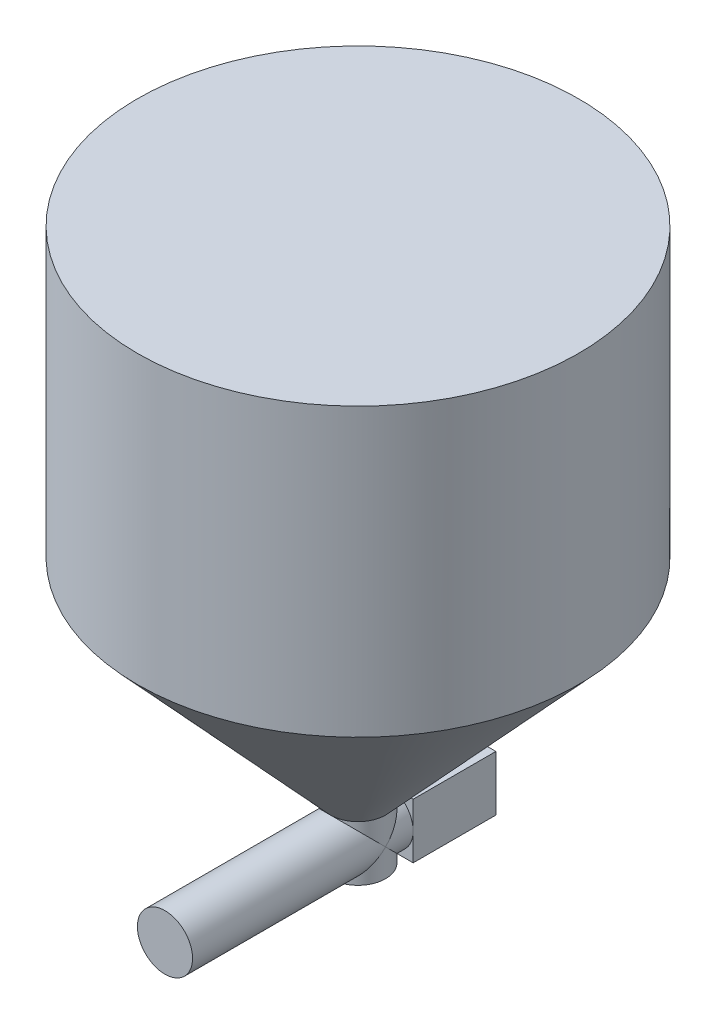
ISO-10303-21;
HEADER;
FILE_DESCRIPTION(('STEP AP214'),'2;1');
FILE_NAME('part.step','',(''),(''),'','','');
FILE_SCHEMA(('AUTOMOTIVE_DESIGN { 1 0 10303 214 1 1 1 1 }'));
ENDSEC;
DATA;
#1=APPLICATION_CONTEXT('core data for automotive mechanical design processes');
#2=APPLICATION_PROTOCOL_DEFINITION('international standard','automotive_design',2000,#1);
#3=PRODUCT_CONTEXT('',#1,'mechanical');
#4=PRODUCT('Part','Part','',(#3));
#5=PRODUCT_RELATED_PRODUCT_CATEGORY('part','',(#4));
#6=PRODUCT_DEFINITION_FORMATION('','',#4);
#7=PRODUCT_DEFINITION_CONTEXT('part definition',#1,'design');
#8=PRODUCT_DEFINITION('design','',#6,#7);
#9=PRODUCT_DEFINITION_SHAPE('','',#8);
#10=(LENGTH_UNIT() NAMED_UNIT(*) SI_UNIT(.MILLI.,.METRE.));
#11=(NAMED_UNIT(*) PLANE_ANGLE_UNIT() SI_UNIT($,.RADIAN.));
#12=(NAMED_UNIT(*) SI_UNIT($,.STERADIAN.) SOLID_ANGLE_UNIT());
#13=UNCERTAINTY_MEASURE_WITH_UNIT(LENGTH_MEASURE(1.E-05),#10,'distance_accuracy_value','');
#14=(GEOMETRIC_REPRESENTATION_CONTEXT(3) GLOBAL_UNCERTAINTY_ASSIGNED_CONTEXT((#13)) GLOBAL_UNIT_ASSIGNED_CONTEXT((#10,
#11,#12)) REPRESENTATION_CONTEXT('',''));
#15=CARTESIAN_POINT('',(0.,0.,0.));
#16=DIRECTION('',(0.,0.,1.));
#17=DIRECTION('',(1.,0.,0.));
#18=AXIS2_PLACEMENT_3D('',#15,#16,#17);
#19=CARTESIAN_POINT('',(0.,-1000.,0.));
#20=DIRECTION('',(0.,1.,0.));
#21=DIRECTION('',(0.,0.,1.));
#22=AXIS2_PLACEMENT_3D('',#19,#20,#21);
#23=CYLINDRICAL_SURFACE('',#22,50.);
#24=CARTESIAN_POINT('',(0.,-950.,0.));
#25=DIRECTION('',(0.,0.707106781186547,-0.707106781186547));
#26=DIRECTION('',(0.,0.707106781186547,0.707106781186547));
#27=AXIS2_PLACEMENT_3D('',#24,#25,#26);
#28=ELLIPSE('',#27,70.7106781186548,50.);
#29=CARTESIAN_POINT('',(-2.66453525910038E-13,-900.,50.));
#30=VERTEX_POINT('',#29);
#31=CARTESIAN_POINT('',(50.,-950.,0.));
#32=VERTEX_POINT('',#31);
#33=EDGE_CURVE('E206',#30,#32,#28,.T.);
#34=ORIENTED_EDGE('',*,*,#33,.T.);
#35=CARTESIAN_POINT('',(0.,-950.,0.));
#36=DIRECTION('',(0.,0.707106781186547,0.707106781186547));
#37=DIRECTION('',(0.,0.707106781186547,-0.707106781186547));
#38=AXIS2_PLACEMENT_3D('',#35,#36,#37);
#39=ELLIPSE('',#38,70.7106781186548,50.);
#40=CARTESIAN_POINT('',(0.,-900.,-50.));
#41=VERTEX_POINT('',#40);
#42=EDGE_CURVE('E201',#32,#41,#39,.T.);
#43=ORIENTED_EDGE('',*,*,#42,.T.);
#44=CARTESIAN_POINT('',(0.,-900.,0.));
#45=DIRECTION('',(0.,-1.,0.));
#46=DIRECTION('',(0.,0.,-1.));
#47=AXIS2_PLACEMENT_3D('',#44,#45,#46);
#48=CIRCLE('',#47,50.);
#49=EDGE_CURVE('E226',#41,#30,#48,.T.);
#50=ORIENTED_EDGE('',*,*,#49,.T.);
#51=EDGE_LOOP('',(#34,#43,#50));
#52=FACE_BOUND('',#51,.T.);
#53=ADVANCED_FACE('F36',(#52),#23,.T.);
#54=CARTESIAN_POINT('',(0.,-520.,0.));
#55=DIRECTION('',(0.,1.,0.));
#56=DIRECTION('',(0.,0.,1.));
#57=AXIS2_PLACEMENT_3D('',#54,#55,#56);
#58=CYLINDRICAL_SURFACE('',#57,400.);
#59=CARTESIAN_POINT('',(0.,-520.,0.));
#60=DIRECTION('',(0.,-1.,0.));
#61=DIRECTION('',(0.,0.,-1.));
#62=AXIS2_PLACEMENT_3D('',#59,#60,#61);
#63=CIRCLE('',#62,400.);
#64=CARTESIAN_POINT('',(0.,-520.,-400.));
#65=VERTEX_POINT('',#64);
#66=EDGE_CURVE('E46',#65,#65,#63,.T.);
#67=ORIENTED_EDGE('',*,*,#66,.F.);
#68=EDGE_LOOP('',(#67));
#69=FACE_BOUND('',#68,.T.);
#70=CARTESIAN_POINT('',(0.,0.,0.));
#71=DIRECTION('',(0.,1.,0.));
#72=DIRECTION('',(0.,0.,1.));
#73=AXIS2_PLACEMENT_3D('',#70,#71,#72);
#74=CIRCLE('',#73,400.);
#75=CARTESIAN_POINT('',(0.,0.,400.));
#76=VERTEX_POINT('',#75);
#77=EDGE_CURVE('E12',#76,#76,#74,.T.);
#78=ORIENTED_EDGE('',*,*,#77,.F.);
#79=EDGE_LOOP('',(#78));
#80=FACE_BOUND('',#79,.T.);
#81=ADVANCED_FACE('F38',(#69,#80),#58,.T.);
#82=CARTESIAN_POINT('',(0.,0.,0.));
#83=DIRECTION('',(0.,1.,0.));
#84=DIRECTION('',(0.,0.,1.));
#85=AXIS2_PLACEMENT_3D('',#82,#83,#84);
#86=PLANE('',#85);
#87=ORIENTED_EDGE('',*,*,#77,.T.);
#88=EDGE_LOOP('',(#87));
#89=FACE_BOUND('',#88,.T.);
#90=ADVANCED_FACE('F242',(#89),#86,.T.);
#91=CARTESIAN_POINT('',(0.,-900.,0.));
#92=DIRECTION('',(0.,1.,0.));
#93=DIRECTION('',(0.,0.,1.));
#94=AXIS2_PLACEMENT_3D('',#91,#92,#93);
#95=CONICAL_SURFACE('',#94,50.,0.744325384806994);
#96=ORIENTED_EDGE('',*,*,#49,.F.);
#97=CARTESIAN_POINT('',(0.,-900.,0.));
#98=DIRECTION('',(0.,-1.,0.));
#99=DIRECTION('',(0.,0.,1.));
#100=AXIS2_PLACEMENT_3D('',#97,#98,#99);
#101=CIRCLE('',#100,50.);
#102=EDGE_CURVE('E276',#30,#41,#101,.T.);
#103=ORIENTED_EDGE('',*,*,#102,.F.);
#104=EDGE_LOOP('',(#96,#103));
#105=FACE_BOUND('',#104,.T.);
#106=ORIENTED_EDGE('',*,*,#66,.T.);
#107=EDGE_LOOP('',(#106));
#108=FACE_BOUND('',#107,.T.);
#109=ADVANCED_FACE('F232',(#105,#108),#95,.T.);
#110=CARTESIAN_POINT('',(-50.,-950.,0.));
#111=VERTEX_POINT('',#110);
#112=EDGE_CURVE('E197',#41,#111,#39,.T.);
#113=ORIENTED_EDGE('',*,*,#112,.T.);
#114=EDGE_CURVE('E209',#111,#30,#28,.T.);
#115=ORIENTED_EDGE('',*,*,#114,.T.);
#116=ORIENTED_EDGE('',*,*,#102,.T.);
#117=EDGE_LOOP('',(#113,#115,#116));
#118=FACE_BOUND('',#117,.T.);
#119=ADVANCED_FACE('F241',(#118),#23,.T.);
#120=CARTESIAN_POINT('',(0.,-950.,350.));
#121=DIRECTION('',(0.,0.,-1.));
#122=DIRECTION('',(-1.,0.,0.));
#123=AXIS2_PLACEMENT_3D('',#120,#121,#122);
#124=PLANE('',#123);
#125=CARTESIAN_POINT('',(0.,-950.,350.));
#126=DIRECTION('',(0.,0.,-1.));
#127=DIRECTION('',(-1.,0.,0.));
#128=AXIS2_PLACEMENT_3D('',#125,#126,#127);
#129=CIRCLE('',#128,50.);
#130=CARTESIAN_POINT('',(-50.,-950.,350.));
#131=VERTEX_POINT('',#130);
#132=EDGE_CURVE('E187',#131,#131,#129,.T.);
#133=ORIENTED_EDGE('',*,*,#132,.F.);
#134=EDGE_LOOP('',(#133));
#135=FACE_BOUND('',#134,.T.);
#136=ADVANCED_FACE('F267',(#135),#124,.F.);
#137=CARTESIAN_POINT('',(0.,-950.,350.));
#138=DIRECTION('',(0.,0.,-1.));
#139=DIRECTION('',(-1.,0.,0.));
#140=AXIS2_PLACEMENT_3D('',#137,#138,#139);
#141=CYLINDRICAL_SURFACE('',#140,50.);
#142=ORIENTED_EDGE('',*,*,#132,.T.);
#143=EDGE_LOOP('',(#142));
#144=FACE_BOUND('',#143,.T.);
#145=CARTESIAN_POINT('',(0.,-950.,0.));
#146=DIRECTION('',(0.,0.707106781186547,0.707106781186547));
#147=DIRECTION('',(0.,0.707106781186547,-0.707106781186547));
#148=AXIS2_PLACEMENT_3D('',#145,#146,#147);
#149=ELLIPSE('',#148,70.7106781186548,50.);
#150=CARTESIAN_POINT('',(0.,-1000.,50.));
#151=VERTEX_POINT('',#150);
#152=EDGE_CURVE('E198',#32,#151,#149,.F.);
#153=ORIENTED_EDGE('',*,*,#152,.F.);
#154=ORIENTED_EDGE('',*,*,#33,.F.);
#155=ORIENTED_EDGE('',*,*,#114,.F.);
#156=EDGE_CURVE('E62',#151,#111,#149,.F.);
#157=ORIENTED_EDGE('',*,*,#156,.F.);
#158=EDGE_LOOP('',(#153,#154,#155,#157));
#159=FACE_BOUND('',#158,.T.);
#160=ADVANCED_FACE('F272',(#144,#159),#141,.T.);
#161=CARTESIAN_POINT('',(0.,-950.,0.));
#162=DIRECTION('',(0.,0.707106781186547,-0.707106781186547));
#163=DIRECTION('',(0.,0.707106781186547,0.707106781186547));
#164=AXIS2_PLACEMENT_3D('',#161,#162,#163);
#165=ELLIPSE('',#164,70.7106781186548,50.);
#166=CARTESIAN_POINT('',(0.,-1000.,-50.));
#167=VERTEX_POINT('',#166);
#168=EDGE_CURVE('E218',#111,#167,#165,.F.);
#169=ORIENTED_EDGE('',*,*,#168,.F.);
#170=ORIENTED_EDGE('',*,*,#112,.F.);
#171=CARTESIAN_POINT('',(0.,-950.,-50.));
#172=DIRECTION('',(0.,0.,-1.));
#173=DIRECTION('',(-1.,0.,0.));
#174=AXIS2_PLACEMENT_3D('',#171,#172,#173);
#175=CIRCLE('',#174,50.);
#176=CARTESIAN_POINT('',(-50.0000000000001,-950.,-50.));
#177=VERTEX_POINT('',#176);
#178=EDGE_CURVE('E54',#41,#177,#175,.F.);
#179=ORIENTED_EDGE('',*,*,#178,.T.);
#180=CARTESIAN_POINT('',(0.,-950.,-50.));
#181=DIRECTION('',(0.,0.,-1.));
#182=DIRECTION('',(-1.,0.,0.));
#183=AXIS2_PLACEMENT_3D('',#180,#181,#182);
#184=CIRCLE('',#183,50.);
#185=EDGE_CURVE('E175',#167,#177,#184,.T.);
#186=ORIENTED_EDGE('',*,*,#185,.F.);
#187=EDGE_LOOP('',(#169,#170,#179,#186));
#188=FACE_BOUND('',#187,.T.);
#189=ADVANCED_FACE('F277',(#188),#141,.T.);
#190=EDGE_CURVE('E215',#167,#32,#165,.F.);
#191=ORIENTED_EDGE('',*,*,#190,.F.);
#192=CARTESIAN_POINT('',(0.,-950.,-50.));
#193=DIRECTION('',(0.,0.,-1.));
#194=DIRECTION('',(-1.,0.,0.));
#195=AXIS2_PLACEMENT_3D('',#192,#193,#194);
#196=CIRCLE('',#195,50.);
#197=CARTESIAN_POINT('',(49.9999999999999,-950.,-50.));
#198=VERTEX_POINT('',#197);
#199=EDGE_CURVE('E133',#167,#198,#196,.F.);
#200=ORIENTED_EDGE('',*,*,#199,.T.);
#201=EDGE_CURVE('E177',#41,#198,#184,.T.);
#202=ORIENTED_EDGE('',*,*,#201,.F.);
#203=ORIENTED_EDGE('',*,*,#42,.F.);
#204=EDGE_LOOP('',(#191,#200,#202,#203));
#205=FACE_BOUND('',#204,.T.);
#206=ADVANCED_FACE('F264',(#205),#141,.T.);
#207=CARTESIAN_POINT('',(0.,-1000.,0.));
#208=DIRECTION('',(0.,-1.,0.));
#209=DIRECTION('',(0.,0.,-1.));
#210=AXIS2_PLACEMENT_3D('',#207,#208,#209);
#211=PLANE('',#210);
#212=CARTESIAN_POINT('',(0.,-1000.,0.));
#213=DIRECTION('',(0.,-1.,0.));
#214=DIRECTION('',(0.,0.,-1.));
#215=AXIS2_PLACEMENT_3D('',#212,#213,#214);
#216=CIRCLE('',#215,50.);
#217=EDGE_CURVE('E222',#151,#167,#216,.T.);
#218=ORIENTED_EDGE('',*,*,#217,.T.);
#219=EDGE_CURVE('E219',#167,#151,#216,.T.);
#220=ORIENTED_EDGE('',*,*,#219,.T.);
#221=EDGE_LOOP('',(#218,#220));
#222=FACE_BOUND('',#221,.T.);
#223=ADVANCED_FACE('F260',(#222),#211,.T.);
#224=ORIENTED_EDGE('',*,*,#156,.T.);
#225=ORIENTED_EDGE('',*,*,#168,.T.);
#226=ORIENTED_EDGE('',*,*,#217,.F.);
#227=EDGE_LOOP('',(#224,#225,#226));
#228=FACE_BOUND('',#227,.T.);
#229=ADVANCED_FACE('F254',(#228),#23,.T.);
#230=ORIENTED_EDGE('',*,*,#190,.T.);
#231=ORIENTED_EDGE('',*,*,#152,.T.);
#232=ORIENTED_EDGE('',*,*,#219,.F.);
#233=EDGE_LOOP('',(#230,#231,#232));
#234=FACE_BOUND('',#233,.T.);
#235=ADVANCED_FACE('F253',(#234),#23,.T.);
#236=CARTESIAN_POINT('',(0.,0.,-50.));
#237=DIRECTION('',(0.,0.,-1.));
#238=DIRECTION('',(-1.,0.,0.));
#239=AXIS2_PLACEMENT_3D('',#236,#237,#238);
#240=PLANE('',#239);
#241=ORIENTED_EDGE('',*,*,#185,.T.);
#242=DIRECTION('',(0.,1.,0.));
#243=VECTOR('',#242,1.);
#244=CARTESIAN_POINT('',(-50.,-900.,-50.));
#245=LINE('',#244,#243);
#246=CARTESIAN_POINT('',(-50.0000000000002,-1000.,-50.));
#247=VERTEX_POINT('',#246);
#248=EDGE_CURVE('E144',#247,#177,#245,.T.);
#249=ORIENTED_EDGE('',*,*,#248,.F.);
#250=DIRECTION('',(-1.,0.,0.));
#251=VECTOR('',#250,1.);
#252=CARTESIAN_POINT('',(49.9999999999999,-1000.,-50.));
#253=LINE('',#252,#251);
#254=EDGE_CURVE('E153',#167,#247,#253,.T.);
#255=ORIENTED_EDGE('',*,*,#254,.F.);
#256=EDGE_LOOP('',(#241,#249,#255));
#257=FACE_BOUND('',#256,.T.);
#258=ADVANCED_FACE('F174',(#257),#240,.F.);
#259=ORIENTED_EDGE('',*,*,#178,.F.);
#260=DIRECTION('',(1.,0.,0.));
#261=VECTOR('',#260,1.);
#262=CARTESIAN_POINT('',(49.9999999999999,-900.,-50.));
#263=LINE('',#262,#261);
#264=CARTESIAN_POINT('',(-50.,-900.,-50.));
#265=VERTEX_POINT('',#264);
#266=EDGE_CURVE('E143',#265,#41,#263,.T.);
#267=ORIENTED_EDGE('',*,*,#266,.F.);
#268=EDGE_CURVE('E131',#177,#265,#245,.T.);
#269=ORIENTED_EDGE('',*,*,#268,.F.);
#270=EDGE_LOOP('',(#259,#267,#269));
#271=FACE_BOUND('',#270,.T.);
#272=ADVANCED_FACE('F180',(#271),#240,.F.);
#273=ORIENTED_EDGE('',*,*,#199,.F.);
#274=CARTESIAN_POINT('',(49.9999999999999,-1000.,-50.));
#275=VERTEX_POINT('',#274);
#276=EDGE_CURVE('E126',#275,#167,#253,.T.);
#277=ORIENTED_EDGE('',*,*,#276,.F.);
#278=DIRECTION('',(0.,-1.,0.));
#279=VECTOR('',#278,1.);
#280=CARTESIAN_POINT('',(49.9999999999999,-900.,-50.));
#281=LINE('',#280,#279);
#282=EDGE_CURVE('E154',#198,#275,#281,.T.);
#283=ORIENTED_EDGE('',*,*,#282,.F.);
#284=EDGE_LOOP('',(#273,#277,#283));
#285=FACE_BOUND('',#284,.T.);
#286=ADVANCED_FACE('F167',(#285),#240,.F.);
#287=CARTESIAN_POINT('',(-50.,-900.,-200.));
#288=DIRECTION('',(1.,0.,0.));
#289=DIRECTION('',(0.,1.,0.));
#290=AXIS2_PLACEMENT_3D('',#287,#288,#289);
#291=PLANE('',#290);
#292=ORIENTED_EDGE('',*,*,#248,.T.);
#293=ORIENTED_EDGE('',*,*,#268,.T.);
#294=DIRECTION('',(0.,0.,1.));
#295=VECTOR('',#294,1.);
#296=CARTESIAN_POINT('',(-50.,-900.,-200.));
#297=LINE('',#296,#295);
#298=CARTESIAN_POINT('',(-50.,-900.,-200.));
#299=VERTEX_POINT('',#298);
#300=EDGE_CURVE('E111',#299,#265,#297,.T.);
#301=ORIENTED_EDGE('',*,*,#300,.F.);
#302=DIRECTION('',(0.,1.,0.));
#303=VECTOR('',#302,1.);
#304=CARTESIAN_POINT('',(-50.,-900.,-200.));
#305=LINE('',#304,#303);
#306=CARTESIAN_POINT('',(-50.0000000000002,-1000.,-200.));
#307=VERTEX_POINT('',#306);
#308=EDGE_CURVE('E117',#307,#299,#305,.T.);
#309=ORIENTED_EDGE('',*,*,#308,.F.);
#310=DIRECTION('',(0.,0.,1.));
#311=VECTOR('',#310,1.);
#312=CARTESIAN_POINT('',(-50.0000000000002,-1000.,-200.));
#313=LINE('',#312,#311);
#314=EDGE_CURVE('E157',#307,#247,#313,.T.);
#315=ORIENTED_EDGE('',*,*,#314,.T.);
#316=EDGE_LOOP('',(#292,#293,#301,#309,#315));
#317=FACE_BOUND('',#316,.T.);
#318=ADVANCED_FACE('F129',(#317),#291,.F.);
#319=CARTESIAN_POINT('',(49.9999999999999,-900.,-200.));
#320=DIRECTION('',(0.,-1.,0.));
#321=DIRECTION('',(0.,0.,-1.));
#322=AXIS2_PLACEMENT_3D('',#319,#320,#321);
#323=PLANE('',#322);
#324=ORIENTED_EDGE('',*,*,#266,.T.);
#325=CARTESIAN_POINT('',(49.9999999999999,-900.,-50.));
#326=VERTEX_POINT('',#325);
#327=EDGE_CURVE('E140',#41,#326,#263,.T.);
#328=ORIENTED_EDGE('',*,*,#327,.T.);
#329=DIRECTION('',(0.,0.,1.));
#330=VECTOR('',#329,1.);
#331=CARTESIAN_POINT('',(49.9999999999999,-900.,-200.));
#332=LINE('',#331,#330);
#333=CARTESIAN_POINT('',(49.9999999999999,-900.,-200.));
#334=VERTEX_POINT('',#333);
#335=EDGE_CURVE('E113',#334,#326,#332,.T.);
#336=ORIENTED_EDGE('',*,*,#335,.F.);
#337=DIRECTION('',(1.,0.,0.));
#338=VECTOR('',#337,1.);
#339=CARTESIAN_POINT('',(49.9999999999999,-900.,-200.));
#340=LINE('',#339,#338);
#341=EDGE_CURVE('E106',#299,#334,#340,.T.);
#342=ORIENTED_EDGE('',*,*,#341,.F.);
#343=ORIENTED_EDGE('',*,*,#300,.T.);
#344=EDGE_LOOP('',(#324,#328,#336,#342,#343));
#345=FACE_BOUND('',#344,.T.);
#346=ADVANCED_FACE('F109',(#345),#323,.F.);
#347=CARTESIAN_POINT('',(49.9999999999999,-900.,-200.));
#348=DIRECTION('',(-1.,0.,0.));
#349=DIRECTION('',(0.,0.,1.));
#350=AXIS2_PLACEMENT_3D('',#347,#348,#349);
#351=PLANE('',#350);
#352=EDGE_CURVE('E149',#326,#198,#281,.T.);
#353=ORIENTED_EDGE('',*,*,#352,.T.);
#354=ORIENTED_EDGE('',*,*,#282,.T.);
#355=DIRECTION('',(0.,0.,1.));
#356=VECTOR('',#355,1.);
#357=CARTESIAN_POINT('',(49.9999999999999,-1000.,-200.));
#358=LINE('',#357,#356);
#359=CARTESIAN_POINT('',(49.9999999999999,-1000.,-200.));
#360=VERTEX_POINT('',#359);
#361=EDGE_CURVE('E136',#360,#275,#358,.T.);
#362=ORIENTED_EDGE('',*,*,#361,.F.);
#363=DIRECTION('',(0.,-1.,0.));
#364=VECTOR('',#363,1.);
#365=CARTESIAN_POINT('',(49.9999999999999,-900.,-200.));
#366=LINE('',#365,#364);
#367=EDGE_CURVE('E116',#334,#360,#366,.T.);
#368=ORIENTED_EDGE('',*,*,#367,.F.);
#369=ORIENTED_EDGE('',*,*,#335,.T.);
#370=EDGE_LOOP('',(#353,#354,#362,#368,#369));
#371=FACE_BOUND('',#370,.T.);
#372=ADVANCED_FACE('F182',(#371),#351,.F.);
#373=CARTESIAN_POINT('',(49.9999999999999,-1000.,-200.));
#374=DIRECTION('',(0.,1.,0.));
#375=DIRECTION('',(0.,0.,1.));
#376=AXIS2_PLACEMENT_3D('',#373,#374,#375);
#377=PLANE('',#376);
#378=ORIENTED_EDGE('',*,*,#276,.T.);
#379=ORIENTED_EDGE('',*,*,#254,.T.);
#380=ORIENTED_EDGE('',*,*,#314,.F.);
#381=DIRECTION('',(-1.,0.,0.));
#382=VECTOR('',#381,1.);
#383=CARTESIAN_POINT('',(49.9999999999999,-1000.,-200.));
#384=LINE('',#383,#382);
#385=EDGE_CURVE('E122',#360,#307,#384,.T.);
#386=ORIENTED_EDGE('',*,*,#385,.F.);
#387=ORIENTED_EDGE('',*,*,#361,.T.);
#388=EDGE_LOOP('',(#378,#379,#380,#386,#387));
#389=FACE_BOUND('',#388,.T.);
#390=ADVANCED_FACE('F162',(#389),#377,.F.);
#391=CARTESIAN_POINT('',(0.,0.,-200.));
#392=DIRECTION('',(0.,0.,-1.));
#393=DIRECTION('',(-1.,0.,0.));
#394=AXIS2_PLACEMENT_3D('',#391,#392,#393);
#395=PLANE('',#394);
#396=ORIENTED_EDGE('',*,*,#308,.T.);
#397=ORIENTED_EDGE('',*,*,#341,.T.);
#398=ORIENTED_EDGE('',*,*,#367,.T.);
#399=ORIENTED_EDGE('',*,*,#385,.T.);
#400=EDGE_LOOP('',(#396,#397,#398,#399));
#401=FACE_BOUND('',#400,.T.);
#402=ADVANCED_FACE('F120',(#401),#395,.T.);
#403=ORIENTED_EDGE('',*,*,#201,.T.);
#404=ORIENTED_EDGE('',*,*,#352,.F.);
#405=ORIENTED_EDGE('',*,*,#327,.F.);
#406=EDGE_LOOP('',(#403,#404,#405));
#407=FACE_BOUND('',#406,.T.);
#408=ADVANCED_FACE('F185',(#407),#240,.F.);
#409=CLOSED_SHELL('',(#53,#81,#90,#109,#119,#136,#160,#189,#206,#223,#229,#235,#258,#272,#286,
#318,#346,#372,#390,#402,#408));
#410=MANIFOLD_SOLID_BREP('B2',#409);
#411=ADVANCED_BREP_SHAPE_REPRESENTATION('',(#18,#410),#14);
#412=SHAPE_DEFINITION_REPRESENTATION(#9,#411);
ENDSEC;
END-ISO-10303-21;
